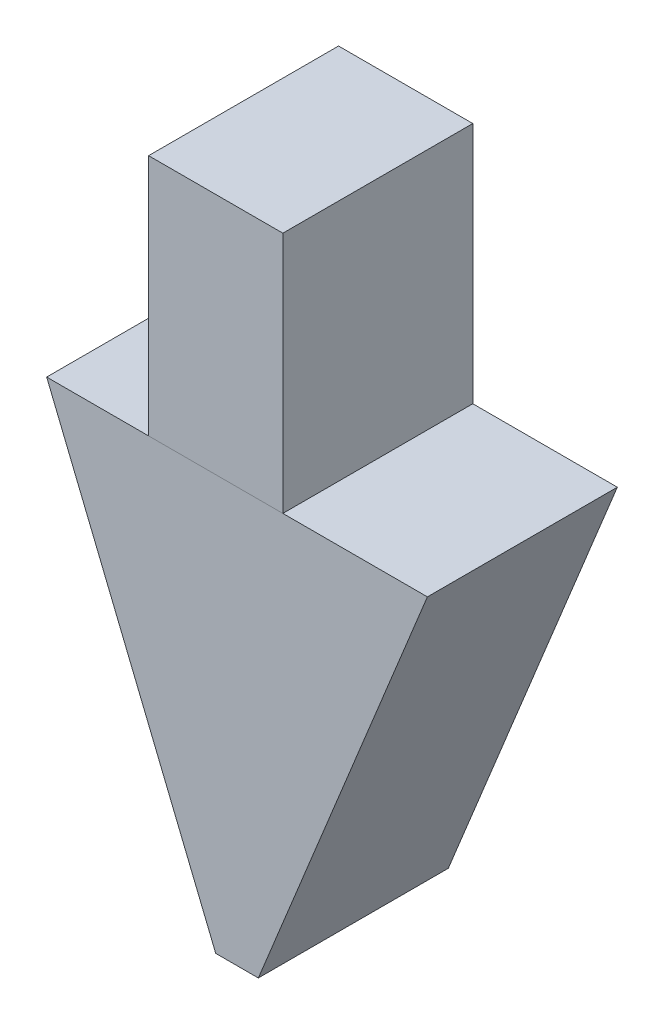
ISO-10303-21;
HEADER;
FILE_DESCRIPTION(('STEP AP214'),'2;1');
FILE_NAME('part.step','',(''),(''),'','','');
FILE_SCHEMA(('AUTOMOTIVE_DESIGN { 1 0 10303 214 1 1 1 1 }'));
ENDSEC;
DATA;
#1=APPLICATION_CONTEXT('core data for automotive mechanical design processes');
#2=APPLICATION_PROTOCOL_DEFINITION('international standard','automotive_design',2000,#1);
#3=PRODUCT_CONTEXT('',#1,'mechanical');
#4=PRODUCT('Part','Part','',(#3));
#5=PRODUCT_RELATED_PRODUCT_CATEGORY('part','',(#4));
#6=PRODUCT_DEFINITION_FORMATION('','',#4);
#7=PRODUCT_DEFINITION_CONTEXT('part definition',#1,'design');
#8=PRODUCT_DEFINITION('design','',#6,#7);
#9=PRODUCT_DEFINITION_SHAPE('','',#8);
#10=(LENGTH_UNIT() NAMED_UNIT(*) SI_UNIT(.MILLI.,.METRE.));
#11=(NAMED_UNIT(*) PLANE_ANGLE_UNIT() SI_UNIT($,.RADIAN.));
#12=(NAMED_UNIT(*) SI_UNIT($,.STERADIAN.) SOLID_ANGLE_UNIT());
#13=UNCERTAINTY_MEASURE_WITH_UNIT(LENGTH_MEASURE(1.E-05),#10,'distance_accuracy_value','');
#14=(GEOMETRIC_REPRESENTATION_CONTEXT(3) GLOBAL_UNCERTAINTY_ASSIGNED_CONTEXT((#13)) GLOBAL_UNIT_ASSIGNED_CONTEXT((#10,
#11,#12)) REPRESENTATION_CONTEXT('',''));
#15=CARTESIAN_POINT('',(0.,0.,0.));
#16=DIRECTION('',(0.,0.,1.));
#17=DIRECTION('',(1.,0.,0.));
#18=AXIS2_PLACEMENT_3D('',#15,#16,#17);
#19=CARTESIAN_POINT('',(-186.243608089276,873.148089650641,200.));
#20=DIRECTION('',(1.,0.,0.));
#21=DIRECTION('',(0.,0.,-1.));
#22=AXIS2_PLACEMENT_3D('',#19,#20,#21);
#23=PLANE('',#22);
#24=DIRECTION('',(0.,-1.,0.));
#25=VECTOR('',#24,1.);
#26=CARTESIAN_POINT('',(-186.243608089276,873.148089650641,-200.));
#27=LINE('',#26,#25);
#28=CARTESIAN_POINT('',(-186.243608089276,1384.25053564055,-200.));
#29=VERTEX_POINT('',#28);
#30=CARTESIAN_POINT('',(-186.243608089276,873.148089650641,-200.));
#31=VERTEX_POINT('',#30);
#32=EDGE_CURVE('E106',#29,#31,#27,.T.);
#33=ORIENTED_EDGE('',*,*,#32,.T.);
#34=DIRECTION('',(0.,0.,-1.));
#35=VECTOR('',#34,1.);
#36=CARTESIAN_POINT('',(-186.243608089276,873.148089650641,200.));
#37=LINE('',#36,#35);
#38=CARTESIAN_POINT('',(-186.243608089276,873.148089650641,200.));
#39=VERTEX_POINT('',#38);
#40=EDGE_CURVE('E12',#39,#31,#37,.T.);
#41=ORIENTED_EDGE('',*,*,#40,.F.);
#42=DIRECTION('',(0.,-1.,0.));
#43=VECTOR('',#42,1.);
#44=CARTESIAN_POINT('',(-186.243608089276,873.148089650641,200.));
#45=LINE('',#44,#43);
#46=CARTESIAN_POINT('',(-186.243608089276,1384.25053564055,200.));
#47=VERTEX_POINT('',#46);
#48=EDGE_CURVE('E94',#47,#39,#45,.T.);
#49=ORIENTED_EDGE('',*,*,#48,.F.);
#50=DIRECTION('',(0.,0.,-1.));
#51=VECTOR('',#50,1.);
#52=CARTESIAN_POINT('',(-186.243608089276,1384.25053564055,200.));
#53=LINE('',#52,#51);
#54=EDGE_CURVE('E102',#47,#29,#53,.T.);
#55=ORIENTED_EDGE('',*,*,#54,.T.);
#56=EDGE_LOOP('',(#33,#41,#49,#55));
#57=FACE_BOUND('',#56,.T.);
#58=ADVANCED_FACE('F43',(#57),#23,.F.);
#59=CARTESIAN_POINT('',(-186.243608089276,873.148089650641,200.));
#60=DIRECTION('',(0.,1.,0.));
#61=DIRECTION('',(-1.,0.,0.));
#62=AXIS2_PLACEMENT_3D('',#59,#60,#61);
#63=PLANE('',#62);
#64=DIRECTION('',(1.,0.,0.));
#65=VECTOR('',#64,1.);
#66=CARTESIAN_POINT('',(-186.243608089276,873.148089650641,-200.));
#67=LINE('',#66,#65);
#68=CARTESIAN_POINT('',(96.4939152242887,873.148089650641,-200.));
#69=VERTEX_POINT('',#68);
#70=EDGE_CURVE('E98',#31,#69,#67,.T.);
#71=ORIENTED_EDGE('',*,*,#70,.T.);
#72=DIRECTION('',(0.,0.,-1.));
#73=VECTOR('',#72,1.);
#74=CARTESIAN_POINT('',(96.4939152242887,873.148089650641,200.));
#75=LINE('',#74,#73);
#76=CARTESIAN_POINT('',(96.4939152242887,873.148089650641,200.));
#77=VERTEX_POINT('',#76);
#78=EDGE_CURVE('E51',#77,#69,#75,.T.);
#79=ORIENTED_EDGE('',*,*,#78,.F.);
#80=DIRECTION('',(1.,0.,0.));
#81=VECTOR('',#80,1.);
#82=CARTESIAN_POINT('',(-186.243608089276,873.148089650641,200.));
#83=LINE('',#82,#81);
#84=EDGE_CURVE('E89',#39,#77,#83,.T.);
#85=ORIENTED_EDGE('',*,*,#84,.F.);
#86=ORIENTED_EDGE('',*,*,#40,.T.);
#87=EDGE_LOOP('',(#71,#79,#85,#86));
#88=FACE_BOUND('',#87,.T.);
#89=ADVANCED_FACE('F97',(#88),#63,.F.);
#90=CARTESIAN_POINT('',(96.4939152242887,873.148089650641,200.));
#91=DIRECTION('',(-1.,0.,0.));
#92=DIRECTION('',(0.,0.,1.));
#93=AXIS2_PLACEMENT_3D('',#90,#91,#92);
#94=PLANE('',#93);
#95=DIRECTION('',(0.,1.,0.));
#96=VECTOR('',#95,1.);
#97=CARTESIAN_POINT('',(96.4939152242887,873.148089650641,-200.));
#98=LINE('',#97,#96);
#99=CARTESIAN_POINT('',(96.4939152242887,1384.25053564055,-200.));
#100=VERTEX_POINT('',#99);
#101=EDGE_CURVE('E76',#69,#100,#98,.T.);
#102=ORIENTED_EDGE('',*,*,#101,.T.);
#103=DIRECTION('',(0.,0.,-1.));
#104=VECTOR('',#103,1.);
#105=CARTESIAN_POINT('',(96.4939152242887,1384.25053564055,200.));
#106=LINE('',#105,#104);
#107=CARTESIAN_POINT('',(96.4939152242887,1384.25053564055,200.));
#108=VERTEX_POINT('',#107);
#109=EDGE_CURVE('E99',#108,#100,#106,.T.);
#110=ORIENTED_EDGE('',*,*,#109,.F.);
#111=DIRECTION('',(0.,1.,0.));
#112=VECTOR('',#111,1.);
#113=CARTESIAN_POINT('',(96.4939152242887,873.148089650641,200.));
#114=LINE('',#113,#112);
#115=EDGE_CURVE('E92',#77,#108,#114,.T.);
#116=ORIENTED_EDGE('',*,*,#115,.F.);
#117=ORIENTED_EDGE('',*,*,#78,.T.);
#118=EDGE_LOOP('',(#102,#110,#116,#117));
#119=FACE_BOUND('',#118,.T.);
#120=ADVANCED_FACE('F100',(#119),#94,.F.);
#121=CARTESIAN_POINT('',(96.4939152242887,1384.25053564055,200.));
#122=DIRECTION('',(0.,-1.,0.));
#123=DIRECTION('',(0.,0.,-1.));
#124=AXIS2_PLACEMENT_3D('',#121,#122,#123);
#125=PLANE('',#124);
#126=DIRECTION('',(-1.,0.,0.));
#127=VECTOR('',#126,1.);
#128=CARTESIAN_POINT('',(96.4939152242887,1384.25053564055,-200.));
#129=LINE('',#128,#127);
#130=EDGE_CURVE('E82',#100,#29,#129,.T.);
#131=ORIENTED_EDGE('',*,*,#130,.T.);
#132=ORIENTED_EDGE('',*,*,#54,.F.);
#133=DIRECTION('',(-1.,0.,0.));
#134=VECTOR('',#133,1.);
#135=CARTESIAN_POINT('',(96.4939152242887,1384.25053564055,200.));
#136=LINE('',#135,#134);
#137=EDGE_CURVE('E59',#108,#47,#136,.T.);
#138=ORIENTED_EDGE('',*,*,#137,.F.);
#139=ORIENTED_EDGE('',*,*,#109,.T.);
#140=EDGE_LOOP('',(#131,#132,#138,#139));
#141=FACE_BOUND('',#140,.T.);
#142=ADVANCED_FACE('F113',(#141),#125,.F.);
#143=CARTESIAN_POINT('',(-186.243608089276,1384.25053564055,200.));
#144=DIRECTION('',(0.,0.,1.));
#145=DIRECTION('',(1.,0.,0.));
#146=AXIS2_PLACEMENT_3D('',#143,#144,#145);
#147=PLANE('',#146);
#148=ORIENTED_EDGE('',*,*,#48,.T.);
#149=ORIENTED_EDGE('',*,*,#84,.T.);
#150=ORIENTED_EDGE('',*,*,#115,.T.);
#151=ORIENTED_EDGE('',*,*,#137,.T.);
#152=EDGE_LOOP('',(#148,#149,#150,#151));
#153=FACE_BOUND('',#152,.T.);
#154=ADVANCED_FACE('F90',(#153),#147,.T.);
#155=CARTESIAN_POINT('',(-186.243608089276,1384.25053564055,-200.));
#156=DIRECTION('',(0.,0.,1.));
#157=DIRECTION('',(1.,0.,0.));
#158=AXIS2_PLACEMENT_3D('',#155,#156,#157);
#159=PLANE('',#158);
#160=ORIENTED_EDGE('',*,*,#32,.F.);
#161=ORIENTED_EDGE('',*,*,#130,.F.);
#162=ORIENTED_EDGE('',*,*,#101,.F.);
#163=ORIENTED_EDGE('',*,*,#70,.F.);
#164=EDGE_LOOP('',(#160,#161,#162,#163));
#165=FACE_BOUND('',#164,.T.);
#166=ADVANCED_FACE('F116',(#165),#159,.F.);
#167=CLOSED_SHELL('',(#58,#89,#120,#142,#154,#166));
#168=MANIFOLD_SOLID_BREP('B2',#167);
#169=CARTESIAN_POINT('',(44.8748464324937,0.,200.));
#170=DIRECTION('',(-0.925986662794402,0.377556221411973,0.));
#171=DIRECTION('',(-0.377556221411973,-0.925986662794402,0.));
#172=AXIS2_PLACEMENT_3D('',#169,#170,#171);
#173=PLANE('',#172);
#174=DIRECTION('',(0.377556221411973,0.925986662794402,0.));
#175=VECTOR('',#174,1.);
#176=CARTESIAN_POINT('',(44.8748464324937,0.,-200.));
#177=LINE('',#176,#175);
#178=CARTESIAN_POINT('',(44.8748464324937,0.,-200.));
#179=VERTEX_POINT('',#178);
#180=CARTESIAN_POINT('',(400.886986463472,873.148089650641,-200.));
#181=VERTEX_POINT('',#180);
#182=EDGE_CURVE('E230',#179,#181,#177,.T.);
#183=ORIENTED_EDGE('',*,*,#182,.T.);
#184=DIRECTION('',(0.,0.,-1.));
#185=VECTOR('',#184,1.);
#186=CARTESIAN_POINT('',(400.886986463472,873.148089650641,200.));
#187=LINE('',#186,#185);
#188=CARTESIAN_POINT('',(400.886986463472,873.148089650641,200.));
#189=VERTEX_POINT('',#188);
#190=EDGE_CURVE('E41',#189,#181,#187,.T.);
#191=ORIENTED_EDGE('',*,*,#190,.F.);
#192=DIRECTION('',(0.377556221411973,0.925986662794402,0.));
#193=VECTOR('',#192,1.);
#194=CARTESIAN_POINT('',(44.8748464324937,0.,200.));
#195=LINE('',#194,#193);
#196=CARTESIAN_POINT('',(44.8748464324937,0.,200.));
#197=VERTEX_POINT('',#196);
#198=EDGE_CURVE('E218',#197,#189,#195,.T.);
#199=ORIENTED_EDGE('',*,*,#198,.F.);
#200=DIRECTION('',(0.,0.,-1.));
#201=VECTOR('',#200,1.);
#202=CARTESIAN_POINT('',(44.8748464324937,0.,200.));
#203=LINE('',#202,#201);
#204=EDGE_CURVE('E226',#197,#179,#203,.T.);
#205=ORIENTED_EDGE('',*,*,#204,.T.);
#206=EDGE_LOOP('',(#183,#191,#199,#205));
#207=FACE_BOUND('',#206,.T.);
#208=ADVANCED_FACE('F167',(#207),#173,.F.);
#209=CARTESIAN_POINT('',(-400.886986463472,873.148089650641,200.));
#210=DIRECTION('',(0.,-1.,0.));
#211=DIRECTION('',(0.,0.,-1.));
#212=AXIS2_PLACEMENT_3D('',#209,#210,#211);
#213=PLANE('',#212);
#214=DIRECTION('',(-1.,0.,0.));
#215=VECTOR('',#214,1.);
#216=CARTESIAN_POINT('',(-400.886986463472,873.148089650641,-200.));
#217=LINE('',#216,#215);
#218=CARTESIAN_POINT('',(-400.886986463472,873.148089650641,-200.));
#219=VERTEX_POINT('',#218);
#220=EDGE_CURVE('E222',#181,#219,#217,.T.);
#221=ORIENTED_EDGE('',*,*,#220,.T.);
#222=DIRECTION('',(0.,0.,-1.));
#223=VECTOR('',#222,1.);
#224=CARTESIAN_POINT('',(-400.886986463472,873.148089650641,200.));
#225=LINE('',#224,#223);
#226=CARTESIAN_POINT('',(-400.886986463472,873.148089650641,200.));
#227=VERTEX_POINT('',#226);
#228=EDGE_CURVE('E175',#227,#219,#225,.T.);
#229=ORIENTED_EDGE('',*,*,#228,.F.);
#230=DIRECTION('',(-1.,0.,0.));
#231=VECTOR('',#230,1.);
#232=CARTESIAN_POINT('',(-400.886986463472,873.148089650641,200.));
#233=LINE('',#232,#231);
#234=EDGE_CURVE('E213',#189,#227,#233,.T.);
#235=ORIENTED_EDGE('',*,*,#234,.F.);
#236=ORIENTED_EDGE('',*,*,#190,.T.);
#237=EDGE_LOOP('',(#221,#229,#235,#236));
#238=FACE_BOUND('',#237,.T.);
#239=ADVANCED_FACE('F221',(#238),#213,.F.);
#240=CARTESIAN_POINT('',(-44.8748464324937,0.,200.));
#241=DIRECTION('',(0.925986662794402,0.377556221411973,0.));
#242=DIRECTION('',(-0.377556221411973,0.925986662794402,0.));
#243=AXIS2_PLACEMENT_3D('',#240,#241,#242);
#244=PLANE('',#243);
#245=DIRECTION('',(0.377556221411973,-0.925986662794402,0.));
#246=VECTOR('',#245,1.);
#247=CARTESIAN_POINT('',(-44.8748464324937,0.,-200.));
#248=LINE('',#247,#246);
#249=CARTESIAN_POINT('',(-44.8748464324937,0.,-200.));
#250=VERTEX_POINT('',#249);
#251=EDGE_CURVE('E200',#219,#250,#248,.T.);
#252=ORIENTED_EDGE('',*,*,#251,.T.);
#253=DIRECTION('',(0.,0.,-1.));
#254=VECTOR('',#253,1.);
#255=CARTESIAN_POINT('',(-44.8748464324937,0.,200.));
#256=LINE('',#255,#254);
#257=CARTESIAN_POINT('',(-44.8748464324937,0.,200.));
#258=VERTEX_POINT('',#257);
#259=EDGE_CURVE('E223',#258,#250,#256,.T.);
#260=ORIENTED_EDGE('',*,*,#259,.F.);
#261=DIRECTION('',(0.377556221411973,-0.925986662794402,0.));
#262=VECTOR('',#261,1.);
#263=CARTESIAN_POINT('',(-44.8748464324937,0.,200.));
#264=LINE('',#263,#262);
#265=EDGE_CURVE('E216',#227,#258,#264,.T.);
#266=ORIENTED_EDGE('',*,*,#265,.F.);
#267=ORIENTED_EDGE('',*,*,#228,.T.);
#268=EDGE_LOOP('',(#252,#260,#266,#267));
#269=FACE_BOUND('',#268,.T.);
#270=ADVANCED_FACE('F224',(#269),#244,.F.);
#271=CARTESIAN_POINT('',(-44.8748464324937,0.,200.));
#272=DIRECTION('',(0.,1.,0.));
#273=DIRECTION('',(0.,0.,1.));
#274=AXIS2_PLACEMENT_3D('',#271,#272,#273);
#275=PLANE('',#274);
#276=DIRECTION('',(1.,0.,0.));
#277=VECTOR('',#276,1.);
#278=CARTESIAN_POINT('',(-44.8748464324937,0.,-200.));
#279=LINE('',#278,#277);
#280=EDGE_CURVE('E206',#250,#179,#279,.T.);
#281=ORIENTED_EDGE('',*,*,#280,.T.);
#282=ORIENTED_EDGE('',*,*,#204,.F.);
#283=DIRECTION('',(1.,0.,0.));
#284=VECTOR('',#283,1.);
#285=CARTESIAN_POINT('',(-44.8748464324937,0.,200.));
#286=LINE('',#285,#284);
#287=EDGE_CURVE('E183',#258,#197,#286,.T.);
#288=ORIENTED_EDGE('',*,*,#287,.F.);
#289=ORIENTED_EDGE('',*,*,#259,.T.);
#290=EDGE_LOOP('',(#281,#282,#288,#289));
#291=FACE_BOUND('',#290,.T.);
#292=ADVANCED_FACE('F237',(#291),#275,.F.);
#293=CARTESIAN_POINT('',(400.886986463472,873.148089650641,200.));
#294=DIRECTION('',(0.,0.,-1.));
#295=DIRECTION('',(-1.,0.,0.));
#296=AXIS2_PLACEMENT_3D('',#293,#294,#295);
#297=PLANE('',#296);
#298=ORIENTED_EDGE('',*,*,#198,.T.);
#299=ORIENTED_EDGE('',*,*,#234,.T.);
#300=ORIENTED_EDGE('',*,*,#265,.T.);
#301=ORIENTED_EDGE('',*,*,#287,.T.);
#302=EDGE_LOOP('',(#298,#299,#300,#301));
#303=FACE_BOUND('',#302,.T.);
#304=ADVANCED_FACE('F214',(#303),#297,.F.);
#305=CARTESIAN_POINT('',(400.886986463472,873.148089650641,-200.));
#306=DIRECTION('',(0.,0.,-1.));
#307=DIRECTION('',(-1.,0.,0.));
#308=AXIS2_PLACEMENT_3D('',#305,#306,#307);
#309=PLANE('',#308);
#310=ORIENTED_EDGE('',*,*,#182,.F.);
#311=ORIENTED_EDGE('',*,*,#280,.F.);
#312=ORIENTED_EDGE('',*,*,#251,.F.);
#313=ORIENTED_EDGE('',*,*,#220,.F.);
#314=EDGE_LOOP('',(#310,#311,#312,#313));
#315=FACE_BOUND('',#314,.T.);
#316=ADVANCED_FACE('F240',(#315),#309,.T.);
#317=CLOSED_SHELL('',(#208,#239,#270,#292,#304,#316));
#318=MANIFOLD_SOLID_BREP('B6',#317);
#319=ADVANCED_BREP_SHAPE_REPRESENTATION('',(#18,#168,#318),#14);
#320=SHAPE_DEFINITION_REPRESENTATION(#9,#319);
ENDSEC;
END-ISO-10303-21;
